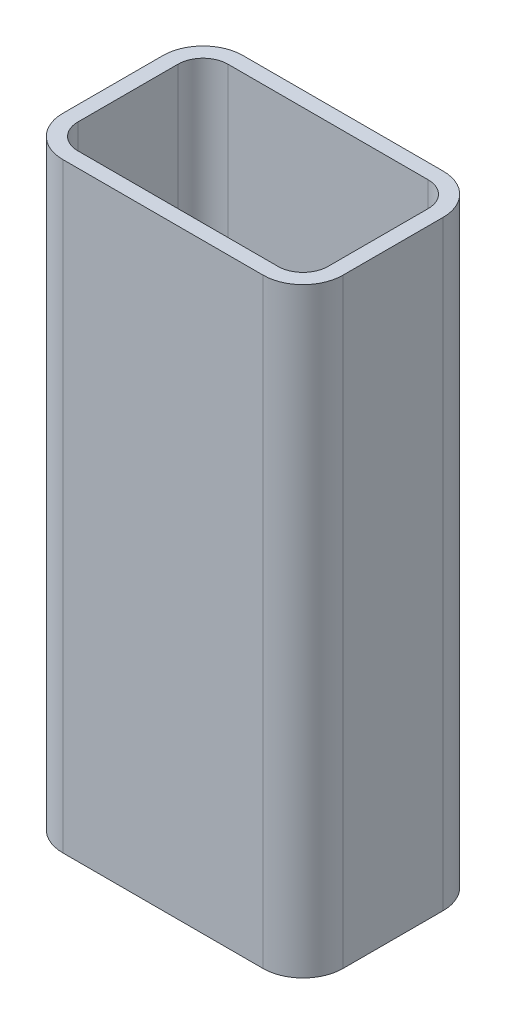
ISO-10303-21;
HEADER;
FILE_DESCRIPTION(('STEP AP214'),'2;1');
FILE_NAME('part.step','',(''),(''),'','','');
FILE_SCHEMA(('AUTOMOTIVE_DESIGN { 1 0 10303 214 1 1 1 1 }'));
ENDSEC;
DATA;
#1=APPLICATION_CONTEXT('core data for automotive mechanical design processes');
#2=APPLICATION_PROTOCOL_DEFINITION('international standard','automotive_design',2000,#1);
#3=PRODUCT_CONTEXT('',#1,'mechanical');
#4=PRODUCT('Part','Part','',(#3));
#5=PRODUCT_RELATED_PRODUCT_CATEGORY('part','',(#4));
#6=PRODUCT_DEFINITION_FORMATION('','',#4);
#7=PRODUCT_DEFINITION_CONTEXT('part definition',#1,'design');
#8=PRODUCT_DEFINITION('design','',#6,#7);
#9=PRODUCT_DEFINITION_SHAPE('','',#8);
#10=(LENGTH_UNIT() NAMED_UNIT(*) SI_UNIT(.MILLI.,.METRE.));
#11=(NAMED_UNIT(*) PLANE_ANGLE_UNIT() SI_UNIT($,.RADIAN.));
#12=(NAMED_UNIT(*) SI_UNIT($,.STERADIAN.) SOLID_ANGLE_UNIT());
#13=UNCERTAINTY_MEASURE_WITH_UNIT(LENGTH_MEASURE(1.E-05),#10,'distance_accuracy_value','');
#14=(GEOMETRIC_REPRESENTATION_CONTEXT(3) GLOBAL_UNCERTAINTY_ASSIGNED_CONTEXT((#13)) GLOBAL_UNIT_ASSIGNED_CONTEXT((#10,
#11,#12)) REPRESENTATION_CONTEXT('',''));
#15=CARTESIAN_POINT('',(0.,0.,0.));
#16=DIRECTION('',(0.,0.,1.));
#17=DIRECTION('',(1.,0.,0.));
#18=AXIS2_PLACEMENT_3D('',#15,#16,#17);
#19=CARTESIAN_POINT('',(-20.,60.,-9.99999999999999));
#20=DIRECTION('',(0.,-1.,0.));
#21=DIRECTION('',(0.,0.,-1.));
#22=AXIS2_PLACEMENT_3D('',#19,#20,#21);
#23=PLANE('',#22);
#24=CARTESIAN_POINT('',(-20.,60.,-9.99999999999999));
#25=DIRECTION('',(0.,-1.,0.));
#26=DIRECTION('',(-1.,0.,0.));
#27=AXIS2_PLACEMENT_3D('',#24,#25,#26);
#28=CIRCLE('',#27,8.);
#29=CARTESIAN_POINT('',(-20.,60.,-18.));
#30=VERTEX_POINT('',#29);
#31=CARTESIAN_POINT('',(-28.,60.,-9.99999999999999));
#32=VERTEX_POINT('',#31);
#33=EDGE_CURVE('E291',#30,#32,#28,.F.);
#34=ORIENTED_EDGE('',*,*,#33,.T.);
#35=DIRECTION('',(0.,0.,1.));
#36=VECTOR('',#35,1.);
#37=CARTESIAN_POINT('',(-28.,60.,-9.99999999999999));
#38=LINE('',#37,#36);
#39=CARTESIAN_POINT('',(-28.,60.,10.));
#40=VERTEX_POINT('',#39);
#41=EDGE_CURVE('E295',#32,#40,#38,.T.);
#42=ORIENTED_EDGE('',*,*,#41,.T.);
#43=CARTESIAN_POINT('',(-20.,60.,10.));
#44=DIRECTION('',(0.,-1.,0.));
#45=DIRECTION('',(-1.,0.,0.));
#46=AXIS2_PLACEMENT_3D('',#43,#44,#45);
#47=CIRCLE('',#46,8.);
#48=CARTESIAN_POINT('',(-20.,60.,18.));
#49=VERTEX_POINT('',#48);
#50=EDGE_CURVE('E299',#40,#49,#47,.F.);
#51=ORIENTED_EDGE('',*,*,#50,.T.);
#52=DIRECTION('',(1.,0.,0.));
#53=VECTOR('',#52,1.);
#54=CARTESIAN_POINT('',(-20.,60.,18.));
#55=LINE('',#54,#53);
#56=CARTESIAN_POINT('',(20.,60.,18.));
#57=VERTEX_POINT('',#56);
#58=EDGE_CURVE('E302',#49,#57,#55,.T.);
#59=ORIENTED_EDGE('',*,*,#58,.T.);
#60=CARTESIAN_POINT('',(20.,60.,10.));
#61=DIRECTION('',(0.,-1.,0.));
#62=DIRECTION('',(-1.,0.,0.));
#63=AXIS2_PLACEMENT_3D('',#60,#61,#62);
#64=CIRCLE('',#63,8.);
#65=CARTESIAN_POINT('',(28.,60.,10.));
#66=VERTEX_POINT('',#65);
#67=EDGE_CURVE('E305',#57,#66,#64,.F.);
#68=ORIENTED_EDGE('',*,*,#67,.T.);
#69=DIRECTION('',(0.,0.,-1.));
#70=VECTOR('',#69,1.);
#71=CARTESIAN_POINT('',(28.,60.,-9.99999999999999));
#72=LINE('',#71,#70);
#73=CARTESIAN_POINT('',(28.,60.,-9.99999999999999));
#74=VERTEX_POINT('',#73);
#75=EDGE_CURVE('E308',#66,#74,#72,.T.);
#76=ORIENTED_EDGE('',*,*,#75,.T.);
#77=CARTESIAN_POINT('',(20.,60.,-9.99999999999999));
#78=DIRECTION('',(0.,-1.,0.));
#79=DIRECTION('',(-1.,0.,0.));
#80=AXIS2_PLACEMENT_3D('',#77,#78,#79);
#81=CIRCLE('',#80,8.);
#82=CARTESIAN_POINT('',(20.,60.,-18.));
#83=VERTEX_POINT('',#82);
#84=EDGE_CURVE('E311',#74,#83,#81,.F.);
#85=ORIENTED_EDGE('',*,*,#84,.T.);
#86=DIRECTION('',(-1.,0.,0.));
#87=VECTOR('',#86,1.);
#88=CARTESIAN_POINT('',(-20.,60.,-18.));
#89=LINE('',#88,#87);
#90=EDGE_CURVE('E314',#83,#30,#89,.T.);
#91=ORIENTED_EDGE('',*,*,#90,.T.);
#92=EDGE_LOOP('',(#34,#42,#51,#59,#68,#76,#85,#91));
#93=FACE_BOUND('',#92,.T.);
#94=CARTESIAN_POINT('',(-20.,60.,-9.99999999999999));
#95=DIRECTION('',(0.,1.,0.));
#96=DIRECTION('',(0.,0.,-1.));
#97=AXIS2_PLACEMENT_3D('',#94,#95,#96);
#98=CIRCLE('',#97,5.);
#99=CARTESIAN_POINT('',(-20.,60.,-15.));
#100=VERTEX_POINT('',#99);
#101=CARTESIAN_POINT('',(-25.,60.,-9.99999999999999));
#102=VERTEX_POINT('',#101);
#103=EDGE_CURVE('E202',#100,#102,#98,.T.);
#104=ORIENTED_EDGE('',*,*,#103,.F.);
#105=DIRECTION('',(-1.,0.,0.));
#106=VECTOR('',#105,1.);
#107=CARTESIAN_POINT('',(-20.,60.,-15.));
#108=LINE('',#107,#106);
#109=CARTESIAN_POINT('',(20.,60.,-15.));
#110=VERTEX_POINT('',#109);
#111=EDGE_CURVE('E243',#110,#100,#108,.T.);
#112=ORIENTED_EDGE('',*,*,#111,.F.);
#113=CARTESIAN_POINT('',(20.,60.,-9.99999999999999));
#114=DIRECTION('',(0.,1.,0.));
#115=DIRECTION('',(0.,0.,-1.));
#116=AXIS2_PLACEMENT_3D('',#113,#114,#115);
#117=CIRCLE('',#116,5.);
#118=CARTESIAN_POINT('',(25.,60.,-9.99999999999999));
#119=VERTEX_POINT('',#118);
#120=EDGE_CURVE('E240',#119,#110,#117,.T.);
#121=ORIENTED_EDGE('',*,*,#120,.F.);
#122=DIRECTION('',(0.,0.,-1.));
#123=VECTOR('',#122,1.);
#124=CARTESIAN_POINT('',(25.,60.,10.));
#125=LINE('',#124,#123);
#126=CARTESIAN_POINT('',(25.,60.,10.));
#127=VERTEX_POINT('',#126);
#128=EDGE_CURVE('E237',#127,#119,#125,.T.);
#129=ORIENTED_EDGE('',*,*,#128,.F.);
#130=CARTESIAN_POINT('',(20.,60.,10.));
#131=DIRECTION('',(0.,1.,0.));
#132=DIRECTION('',(0.,0.,1.));
#133=AXIS2_PLACEMENT_3D('',#130,#131,#132);
#134=CIRCLE('',#133,5.);
#135=CARTESIAN_POINT('',(20.,60.,15.));
#136=VERTEX_POINT('',#135);
#137=EDGE_CURVE('E234',#136,#127,#134,.T.);
#138=ORIENTED_EDGE('',*,*,#137,.F.);
#139=DIRECTION('',(1.,0.,0.));
#140=VECTOR('',#139,1.);
#141=CARTESIAN_POINT('',(-20.,60.,15.));
#142=LINE('',#141,#140);
#143=CARTESIAN_POINT('',(-20.,60.,15.));
#144=VERTEX_POINT('',#143);
#145=EDGE_CURVE('E229',#144,#136,#142,.T.);
#146=ORIENTED_EDGE('',*,*,#145,.F.);
#147=CARTESIAN_POINT('',(-20.,60.,10.));
#148=DIRECTION('',(0.,1.,0.));
#149=DIRECTION('',(0.,0.,-1.));
#150=AXIS2_PLACEMENT_3D('',#147,#148,#149);
#151=CIRCLE('',#150,5.);
#152=CARTESIAN_POINT('',(-25.,60.,10.));
#153=VERTEX_POINT('',#152);
#154=EDGE_CURVE('E225',#153,#144,#151,.T.);
#155=ORIENTED_EDGE('',*,*,#154,.F.);
#156=DIRECTION('',(0.,0.,1.));
#157=VECTOR('',#156,1.);
#158=CARTESIAN_POINT('',(-25.,60.,10.));
#159=LINE('',#158,#157);
#160=EDGE_CURVE('E211',#102,#153,#159,.T.);
#161=ORIENTED_EDGE('',*,*,#160,.F.);
#162=EDGE_LOOP('',(#104,#112,#121,#129,#138,#146,#155,#161));
#163=FACE_BOUND('',#162,.T.);
#164=ADVANCED_FACE('F88',(#93,#163),#23,.F.);
#165=CARTESIAN_POINT('',(-20.,-60.,-9.99999999999999));
#166=DIRECTION('',(0.,-1.,0.));
#167=DIRECTION('',(0.,0.,-1.));
#168=AXIS2_PLACEMENT_3D('',#165,#166,#167);
#169=PLANE('',#168);
#170=CARTESIAN_POINT('',(-20.,-60.,-9.99999999999999));
#171=DIRECTION('',(0.,-1.,0.));
#172=DIRECTION('',(-1.,0.,0.));
#173=AXIS2_PLACEMENT_3D('',#170,#171,#172);
#174=CIRCLE('',#173,8.);
#175=CARTESIAN_POINT('',(-20.,-60.,-18.));
#176=VERTEX_POINT('',#175);
#177=CARTESIAN_POINT('',(-28.,-60.,-9.99999999999999));
#178=VERTEX_POINT('',#177);
#179=EDGE_CURVE('E220',#176,#178,#174,.F.);
#180=ORIENTED_EDGE('',*,*,#179,.F.);
#181=DIRECTION('',(-1.,0.,0.));
#182=VECTOR('',#181,1.);
#183=CARTESIAN_POINT('',(-20.,-60.,-18.));
#184=LINE('',#183,#182);
#185=CARTESIAN_POINT('',(20.,-60.,-18.));
#186=VERTEX_POINT('',#185);
#187=EDGE_CURVE('E296',#186,#176,#184,.T.);
#188=ORIENTED_EDGE('',*,*,#187,.F.);
#189=CARTESIAN_POINT('',(20.,-60.,-9.99999999999999));
#190=DIRECTION('',(0.,-1.,0.));
#191=DIRECTION('',(-1.,0.,0.));
#192=AXIS2_PLACEMENT_3D('',#189,#190,#191);
#193=CIRCLE('',#192,8.);
#194=CARTESIAN_POINT('',(28.,-60.,-9.99999999999999));
#195=VERTEX_POINT('',#194);
#196=EDGE_CURVE('E336',#195,#186,#193,.F.);
#197=ORIENTED_EDGE('',*,*,#196,.F.);
#198=DIRECTION('',(0.,0.,-1.));
#199=VECTOR('',#198,1.);
#200=CARTESIAN_POINT('',(28.,-60.,-9.99999999999999));
#201=LINE('',#200,#199);
#202=CARTESIAN_POINT('',(28.,-60.,10.));
#203=VERTEX_POINT('',#202);
#204=EDGE_CURVE('E333',#203,#195,#201,.T.);
#205=ORIENTED_EDGE('',*,*,#204,.F.);
#206=CARTESIAN_POINT('',(20.,-60.,10.));
#207=DIRECTION('',(0.,-1.,0.));
#208=DIRECTION('',(-1.,0.,0.));
#209=AXIS2_PLACEMENT_3D('',#206,#207,#208);
#210=CIRCLE('',#209,8.);
#211=CARTESIAN_POINT('',(20.,-60.,18.));
#212=VERTEX_POINT('',#211);
#213=EDGE_CURVE('E330',#212,#203,#210,.F.);
#214=ORIENTED_EDGE('',*,*,#213,.F.);
#215=DIRECTION('',(1.,0.,0.));
#216=VECTOR('',#215,1.);
#217=CARTESIAN_POINT('',(-20.,-60.,18.));
#218=LINE('',#217,#216);
#219=CARTESIAN_POINT('',(-20.,-60.,18.));
#220=VERTEX_POINT('',#219);
#221=EDGE_CURVE('E327',#220,#212,#218,.T.);
#222=ORIENTED_EDGE('',*,*,#221,.F.);
#223=CARTESIAN_POINT('',(-20.,-60.,10.));
#224=DIRECTION('',(0.,-1.,0.));
#225=DIRECTION('',(-1.,0.,0.));
#226=AXIS2_PLACEMENT_3D('',#223,#224,#225);
#227=CIRCLE('',#226,8.);
#228=CARTESIAN_POINT('',(-28.,-60.,10.));
#229=VERTEX_POINT('',#228);
#230=EDGE_CURVE('E324',#229,#220,#227,.F.);
#231=ORIENTED_EDGE('',*,*,#230,.F.);
#232=DIRECTION('',(0.,0.,1.));
#233=VECTOR('',#232,1.);
#234=CARTESIAN_POINT('',(-28.,-60.,-9.99999999999999));
#235=LINE('',#234,#233);
#236=EDGE_CURVE('E321',#178,#229,#235,.T.);
#237=ORIENTED_EDGE('',*,*,#236,.F.);
#238=EDGE_LOOP('',(#180,#188,#197,#205,#214,#222,#231,#237));
#239=FACE_BOUND('',#238,.T.);
#240=DIRECTION('',(-1.,0.,0.));
#241=VECTOR('',#240,1.);
#242=CARTESIAN_POINT('',(-20.,-60.,-15.));
#243=LINE('',#242,#241);
#244=CARTESIAN_POINT('',(20.,-60.,-15.));
#245=VERTEX_POINT('',#244);
#246=CARTESIAN_POINT('',(-20.,-60.,-15.));
#247=VERTEX_POINT('',#246);
#248=EDGE_CURVE('E212',#245,#247,#243,.T.);
#249=ORIENTED_EDGE('',*,*,#248,.T.);
#250=CARTESIAN_POINT('',(-20.,-60.,-9.99999999999999));
#251=DIRECTION('',(0.,1.,0.));
#252=DIRECTION('',(0.,0.,-1.));
#253=AXIS2_PLACEMENT_3D('',#250,#251,#252);
#254=CIRCLE('',#253,5.);
#255=CARTESIAN_POINT('',(-25.,-60.,-9.99999999999999));
#256=VERTEX_POINT('',#255);
#257=EDGE_CURVE('E112',#247,#256,#254,.T.);
#258=ORIENTED_EDGE('',*,*,#257,.T.);
#259=DIRECTION('',(0.,0.,1.));
#260=VECTOR('',#259,1.);
#261=CARTESIAN_POINT('',(-25.,-60.,10.));
#262=LINE('',#261,#260);
#263=CARTESIAN_POINT('',(-25.,-60.,10.));
#264=VERTEX_POINT('',#263);
#265=EDGE_CURVE('E218',#256,#264,#262,.T.);
#266=ORIENTED_EDGE('',*,*,#265,.T.);
#267=CARTESIAN_POINT('',(-20.,-60.,10.));
#268=DIRECTION('',(0.,1.,0.));
#269=DIRECTION('',(0.,0.,-1.));
#270=AXIS2_PLACEMENT_3D('',#267,#268,#269);
#271=CIRCLE('',#270,5.);
#272=CARTESIAN_POINT('',(-20.,-60.,15.));
#273=VERTEX_POINT('',#272);
#274=EDGE_CURVE('E250',#264,#273,#271,.T.);
#275=ORIENTED_EDGE('',*,*,#274,.T.);
#276=DIRECTION('',(1.,0.,0.));
#277=VECTOR('',#276,1.);
#278=CARTESIAN_POINT('',(-20.,-60.,15.));
#279=LINE('',#278,#277);
#280=CARTESIAN_POINT('',(20.,-60.,15.));
#281=VERTEX_POINT('',#280);
#282=EDGE_CURVE('E254',#273,#281,#279,.T.);
#283=ORIENTED_EDGE('',*,*,#282,.T.);
#284=CARTESIAN_POINT('',(20.,-60.,10.));
#285=DIRECTION('',(0.,1.,0.));
#286=DIRECTION('',(0.,0.,1.));
#287=AXIS2_PLACEMENT_3D('',#284,#285,#286);
#288=CIRCLE('',#287,5.);
#289=CARTESIAN_POINT('',(25.,-60.,10.));
#290=VERTEX_POINT('',#289);
#291=EDGE_CURVE('E258',#281,#290,#288,.T.);
#292=ORIENTED_EDGE('',*,*,#291,.T.);
#293=DIRECTION('',(0.,0.,-1.));
#294=VECTOR('',#293,1.);
#295=CARTESIAN_POINT('',(25.,-60.,10.));
#296=LINE('',#295,#294);
#297=CARTESIAN_POINT('',(25.,-60.,-9.99999999999999));
#298=VERTEX_POINT('',#297);
#299=EDGE_CURVE('E262',#290,#298,#296,.T.);
#300=ORIENTED_EDGE('',*,*,#299,.T.);
#301=CARTESIAN_POINT('',(20.,-60.,-9.99999999999999));
#302=DIRECTION('',(0.,1.,0.));
#303=DIRECTION('',(0.,0.,-1.));
#304=AXIS2_PLACEMENT_3D('',#301,#302,#303);
#305=CIRCLE('',#304,5.);
#306=EDGE_CURVE('E266',#298,#245,#305,.T.);
#307=ORIENTED_EDGE('',*,*,#306,.T.);
#308=EDGE_LOOP('',(#249,#258,#266,#275,#283,#292,#300,#307));
#309=FACE_BOUND('',#308,.T.);
#310=ADVANCED_FACE('F375',(#239,#309),#169,.T.);
#311=CARTESIAN_POINT('',(-20.,60.,-9.99999999999999));
#312=DIRECTION('',(0.,-1.,0.));
#313=DIRECTION('',(0.,0.,-1.));
#314=AXIS2_PLACEMENT_3D('',#311,#312,#313);
#315=CYLINDRICAL_SURFACE('',#314,8.);
#316=ORIENTED_EDGE('',*,*,#179,.T.);
#317=DIRECTION('',(0.,-1.,0.));
#318=VECTOR('',#317,1.);
#319=CARTESIAN_POINT('',(-28.,60.,-9.99999999999999));
#320=LINE('',#319,#318);
#321=EDGE_CURVE('E12',#32,#178,#320,.T.);
#322=ORIENTED_EDGE('',*,*,#321,.F.);
#323=ORIENTED_EDGE('',*,*,#33,.F.);
#324=DIRECTION('',(0.,-1.,0.));
#325=VECTOR('',#324,1.);
#326=CARTESIAN_POINT('',(-20.,60.,-18.));
#327=LINE('',#326,#325);
#328=EDGE_CURVE('E317',#30,#176,#327,.T.);
#329=ORIENTED_EDGE('',*,*,#328,.T.);
#330=EDGE_LOOP('',(#316,#322,#323,#329));
#331=FACE_BOUND('',#330,.T.);
#332=ADVANCED_FACE('F90',(#331),#315,.T.);
#333=CARTESIAN_POINT('',(-28.,60.,-9.99999999999999));
#334=DIRECTION('',(1.,0.,0.));
#335=DIRECTION('',(0.,0.,-1.));
#336=AXIS2_PLACEMENT_3D('',#333,#334,#335);
#337=PLANE('',#336);
#338=ORIENTED_EDGE('',*,*,#236,.T.);
#339=DIRECTION('',(0.,-1.,0.));
#340=VECTOR('',#339,1.);
#341=CARTESIAN_POINT('',(-28.,60.,10.));
#342=LINE('',#341,#340);
#343=EDGE_CURVE('E97',#40,#229,#342,.T.);
#344=ORIENTED_EDGE('',*,*,#343,.F.);
#345=ORIENTED_EDGE('',*,*,#41,.F.);
#346=ORIENTED_EDGE('',*,*,#321,.T.);
#347=EDGE_LOOP('',(#338,#344,#345,#346));
#348=FACE_BOUND('',#347,.T.);
#349=ADVANCED_FACE('F392',(#348),#337,.F.);
#350=CARTESIAN_POINT('',(-20.,60.,10.));
#351=DIRECTION('',(0.,-1.,0.));
#352=DIRECTION('',(0.,0.,-1.));
#353=AXIS2_PLACEMENT_3D('',#350,#351,#352);
#354=CYLINDRICAL_SURFACE('',#353,8.);
#355=ORIENTED_EDGE('',*,*,#230,.T.);
#356=DIRECTION('',(0.,-1.,0.));
#357=VECTOR('',#356,1.);
#358=CARTESIAN_POINT('',(-20.,60.,18.));
#359=LINE('',#358,#357);
#360=EDGE_CURVE('E360',#49,#220,#359,.T.);
#361=ORIENTED_EDGE('',*,*,#360,.F.);
#362=ORIENTED_EDGE('',*,*,#50,.F.);
#363=ORIENTED_EDGE('',*,*,#343,.T.);
#364=EDGE_LOOP('',(#355,#361,#362,#363));
#365=FACE_BOUND('',#364,.T.);
#366=ADVANCED_FACE('F369',(#365),#354,.T.);
#367=CARTESIAN_POINT('',(-20.,60.,18.));
#368=DIRECTION('',(0.,0.,-1.));
#369=DIRECTION('',(-1.,0.,0.));
#370=AXIS2_PLACEMENT_3D('',#367,#368,#369);
#371=PLANE('',#370);
#372=ORIENTED_EDGE('',*,*,#221,.T.);
#373=DIRECTION('',(0.,-1.,0.));
#374=VECTOR('',#373,1.);
#375=CARTESIAN_POINT('',(20.,60.,18.));
#376=LINE('',#375,#374);
#377=EDGE_CURVE('E356',#57,#212,#376,.T.);
#378=ORIENTED_EDGE('',*,*,#377,.F.);
#379=ORIENTED_EDGE('',*,*,#58,.F.);
#380=ORIENTED_EDGE('',*,*,#360,.T.);
#381=EDGE_LOOP('',(#372,#378,#379,#380));
#382=FACE_BOUND('',#381,.T.);
#383=ADVANCED_FACE('F381',(#382),#371,.F.);
#384=CARTESIAN_POINT('',(20.,60.,10.));
#385=DIRECTION('',(0.,-1.,0.));
#386=DIRECTION('',(0.,0.,-1.));
#387=AXIS2_PLACEMENT_3D('',#384,#385,#386);
#388=CYLINDRICAL_SURFACE('',#387,8.);
#389=ORIENTED_EDGE('',*,*,#213,.T.);
#390=DIRECTION('',(0.,-1.,0.));
#391=VECTOR('',#390,1.);
#392=CARTESIAN_POINT('',(28.,60.,10.));
#393=LINE('',#392,#391);
#394=EDGE_CURVE('E352',#66,#203,#393,.T.);
#395=ORIENTED_EDGE('',*,*,#394,.F.);
#396=ORIENTED_EDGE('',*,*,#67,.F.);
#397=ORIENTED_EDGE('',*,*,#377,.T.);
#398=EDGE_LOOP('',(#389,#395,#396,#397));
#399=FACE_BOUND('',#398,.T.);
#400=ADVANCED_FACE('F385',(#399),#388,.T.);
#401=CARTESIAN_POINT('',(28.,60.,-9.99999999999999));
#402=DIRECTION('',(-1.,0.,0.));
#403=DIRECTION('',(0.,0.,1.));
#404=AXIS2_PLACEMENT_3D('',#401,#402,#403);
#405=PLANE('',#404);
#406=ORIENTED_EDGE('',*,*,#204,.T.);
#407=DIRECTION('',(0.,-1.,0.));
#408=VECTOR('',#407,1.);
#409=CARTESIAN_POINT('',(28.,60.,-9.99999999999999));
#410=LINE('',#409,#408);
#411=EDGE_CURVE('E348',#74,#195,#410,.T.);
#412=ORIENTED_EDGE('',*,*,#411,.F.);
#413=ORIENTED_EDGE('',*,*,#75,.F.);
#414=ORIENTED_EDGE('',*,*,#394,.T.);
#415=EDGE_LOOP('',(#406,#412,#413,#414));
#416=FACE_BOUND('',#415,.T.);
#417=ADVANCED_FACE('F405',(#416),#405,.F.);
#418=CARTESIAN_POINT('',(20.,60.,-9.99999999999999));
#419=DIRECTION('',(0.,-1.,0.));
#420=DIRECTION('',(0.,0.,-1.));
#421=AXIS2_PLACEMENT_3D('',#418,#419,#420);
#422=CYLINDRICAL_SURFACE('',#421,8.);
#423=ORIENTED_EDGE('',*,*,#196,.T.);
#424=DIRECTION('',(0.,-1.,0.));
#425=VECTOR('',#424,1.);
#426=CARTESIAN_POINT('',(20.,60.,-18.));
#427=LINE('',#426,#425);
#428=EDGE_CURVE('E344',#83,#186,#427,.T.);
#429=ORIENTED_EDGE('',*,*,#428,.F.);
#430=ORIENTED_EDGE('',*,*,#84,.F.);
#431=ORIENTED_EDGE('',*,*,#411,.T.);
#432=EDGE_LOOP('',(#423,#429,#430,#431));
#433=FACE_BOUND('',#432,.T.);
#434=ADVANCED_FACE('F403',(#433),#422,.T.);
#435=CARTESIAN_POINT('',(-20.,60.,-18.));
#436=DIRECTION('',(0.,0.,1.));
#437=DIRECTION('',(1.,0.,0.));
#438=AXIS2_PLACEMENT_3D('',#435,#436,#437);
#439=PLANE('',#438);
#440=ORIENTED_EDGE('',*,*,#187,.T.);
#441=ORIENTED_EDGE('',*,*,#328,.F.);
#442=ORIENTED_EDGE('',*,*,#90,.F.);
#443=ORIENTED_EDGE('',*,*,#428,.T.);
#444=EDGE_LOOP('',(#440,#441,#442,#443));
#445=FACE_BOUND('',#444,.T.);
#446=ADVANCED_FACE('F398',(#445),#439,.F.);
#447=CARTESIAN_POINT('',(-20.,60.,-9.99999999999999));
#448=DIRECTION('',(0.,-1.,0.));
#449=DIRECTION('',(0.,0.,-1.));
#450=AXIS2_PLACEMENT_3D('',#447,#448,#449);
#451=CYLINDRICAL_SURFACE('',#450,5.);
#452=ORIENTED_EDGE('',*,*,#257,.F.);
#453=DIRECTION('',(0.,-1.,0.));
#454=VECTOR('',#453,1.);
#455=CARTESIAN_POINT('',(-20.,60.,-15.));
#456=LINE('',#455,#454);
#457=EDGE_CURVE('E206',#100,#247,#456,.T.);
#458=ORIENTED_EDGE('',*,*,#457,.F.);
#459=ORIENTED_EDGE('',*,*,#103,.T.);
#460=DIRECTION('',(0.,-1.,0.));
#461=VECTOR('',#460,1.);
#462=CARTESIAN_POINT('',(-25.,60.,-9.99999999999999));
#463=LINE('',#462,#461);
#464=EDGE_CURVE('E205',#102,#256,#463,.T.);
#465=ORIENTED_EDGE('',*,*,#464,.T.);
#466=EDGE_LOOP('',(#452,#458,#459,#465));
#467=FACE_BOUND('',#466,.T.);
#468=ADVANCED_FACE('F204',(#467),#451,.F.);
#469=CARTESIAN_POINT('',(-25.,60.,10.));
#470=DIRECTION('',(1.,0.,0.));
#471=DIRECTION('',(0.,0.,-1.));
#472=AXIS2_PLACEMENT_3D('',#469,#470,#471);
#473=PLANE('',#472);
#474=ORIENTED_EDGE('',*,*,#265,.F.);
#475=ORIENTED_EDGE('',*,*,#464,.F.);
#476=ORIENTED_EDGE('',*,*,#160,.T.);
#477=DIRECTION('',(0.,-1.,0.));
#478=VECTOR('',#477,1.);
#479=CARTESIAN_POINT('',(-25.,60.,10.));
#480=LINE('',#479,#478);
#481=EDGE_CURVE('E221',#153,#264,#480,.T.);
#482=ORIENTED_EDGE('',*,*,#481,.T.);
#483=EDGE_LOOP('',(#474,#475,#476,#482));
#484=FACE_BOUND('',#483,.T.);
#485=ADVANCED_FACE('F215',(#484),#473,.T.);
#486=CARTESIAN_POINT('',(-20.,60.,10.));
#487=DIRECTION('',(0.,-1.,0.));
#488=DIRECTION('',(0.,0.,-1.));
#489=AXIS2_PLACEMENT_3D('',#486,#487,#488);
#490=CYLINDRICAL_SURFACE('',#489,5.);
#491=ORIENTED_EDGE('',*,*,#274,.F.);
#492=ORIENTED_EDGE('',*,*,#481,.F.);
#493=ORIENTED_EDGE('',*,*,#154,.T.);
#494=DIRECTION('',(0.,-1.,0.));
#495=VECTOR('',#494,1.);
#496=CARTESIAN_POINT('',(-20.,60.,15.));
#497=LINE('',#496,#495);
#498=EDGE_CURVE('E286',#144,#273,#497,.T.);
#499=ORIENTED_EDGE('',*,*,#498,.T.);
#500=EDGE_LOOP('',(#491,#492,#493,#499));
#501=FACE_BOUND('',#500,.T.);
#502=ADVANCED_FACE('F430',(#501),#490,.F.);
#503=CARTESIAN_POINT('',(-20.,60.,15.));
#504=DIRECTION('',(0.,0.,-1.));
#505=DIRECTION('',(-1.,0.,0.));
#506=AXIS2_PLACEMENT_3D('',#503,#504,#505);
#507=PLANE('',#506);
#508=ORIENTED_EDGE('',*,*,#282,.F.);
#509=ORIENTED_EDGE('',*,*,#498,.F.);
#510=ORIENTED_EDGE('',*,*,#145,.T.);
#511=DIRECTION('',(0.,-1.,0.));
#512=VECTOR('',#511,1.);
#513=CARTESIAN_POINT('',(20.,60.,15.));
#514=LINE('',#513,#512);
#515=EDGE_CURVE('E283',#136,#281,#514,.T.);
#516=ORIENTED_EDGE('',*,*,#515,.T.);
#517=EDGE_LOOP('',(#508,#509,#510,#516));
#518=FACE_BOUND('',#517,.T.);
#519=ADVANCED_FACE('F434',(#518),#507,.T.);
#520=CARTESIAN_POINT('',(20.,60.,10.));
#521=DIRECTION('',(0.,-1.,0.));
#522=DIRECTION('',(0.,0.,-1.));
#523=AXIS2_PLACEMENT_3D('',#520,#521,#522);
#524=CYLINDRICAL_SURFACE('',#523,5.);
#525=ORIENTED_EDGE('',*,*,#291,.F.);
#526=ORIENTED_EDGE('',*,*,#515,.F.);
#527=ORIENTED_EDGE('',*,*,#137,.T.);
#528=DIRECTION('',(0.,-1.,0.));
#529=VECTOR('',#528,1.);
#530=CARTESIAN_POINT('',(25.,60.,10.));
#531=LINE('',#530,#529);
#532=EDGE_CURVE('E280',#127,#290,#531,.T.);
#533=ORIENTED_EDGE('',*,*,#532,.T.);
#534=EDGE_LOOP('',(#525,#526,#527,#533));
#535=FACE_BOUND('',#534,.T.);
#536=ADVANCED_FACE('F440',(#535),#524,.F.);
#537=CARTESIAN_POINT('',(25.,60.,10.));
#538=DIRECTION('',(-1.,0.,0.));
#539=DIRECTION('',(0.,0.,1.));
#540=AXIS2_PLACEMENT_3D('',#537,#538,#539);
#541=PLANE('',#540);
#542=ORIENTED_EDGE('',*,*,#299,.F.);
#543=ORIENTED_EDGE('',*,*,#532,.F.);
#544=ORIENTED_EDGE('',*,*,#128,.T.);
#545=DIRECTION('',(0.,-1.,0.));
#546=VECTOR('',#545,1.);
#547=CARTESIAN_POINT('',(25.,60.,-9.99999999999999));
#548=LINE('',#547,#546);
#549=EDGE_CURVE('E277',#119,#298,#548,.T.);
#550=ORIENTED_EDGE('',*,*,#549,.T.);
#551=EDGE_LOOP('',(#542,#543,#544,#550));
#552=FACE_BOUND('',#551,.T.);
#553=ADVANCED_FACE('F444',(#552),#541,.T.);
#554=CARTESIAN_POINT('',(20.,60.,-9.99999999999999));
#555=DIRECTION('',(0.,-1.,0.));
#556=DIRECTION('',(0.,0.,-1.));
#557=AXIS2_PLACEMENT_3D('',#554,#555,#556);
#558=CYLINDRICAL_SURFACE('',#557,5.);
#559=ORIENTED_EDGE('',*,*,#306,.F.);
#560=ORIENTED_EDGE('',*,*,#549,.F.);
#561=ORIENTED_EDGE('',*,*,#120,.T.);
#562=DIRECTION('',(0.,-1.,0.));
#563=VECTOR('',#562,1.);
#564=CARTESIAN_POINT('',(20.,60.,-15.));
#565=LINE('',#564,#563);
#566=EDGE_CURVE('E104',#110,#245,#565,.T.);
#567=ORIENTED_EDGE('',*,*,#566,.T.);
#568=EDGE_LOOP('',(#559,#560,#561,#567));
#569=FACE_BOUND('',#568,.T.);
#570=ADVANCED_FACE('F448',(#569),#558,.F.);
#571=CARTESIAN_POINT('',(-20.,60.,-15.));
#572=DIRECTION('',(0.,0.,1.));
#573=DIRECTION('',(1.,0.,0.));
#574=AXIS2_PLACEMENT_3D('',#571,#572,#573);
#575=PLANE('',#574);
#576=ORIENTED_EDGE('',*,*,#248,.F.);
#577=ORIENTED_EDGE('',*,*,#566,.F.);
#578=ORIENTED_EDGE('',*,*,#111,.T.);
#579=ORIENTED_EDGE('',*,*,#457,.T.);
#580=EDGE_LOOP('',(#576,#577,#578,#579));
#581=FACE_BOUND('',#580,.T.);
#582=ADVANCED_FACE('F452',(#581),#575,.T.);
#583=CLOSED_SHELL('',(#164,#310,#332,#349,#366,#383,#400,#417,#434,#446,#468,#485,#502,#519,
#536,#553,#570,#582));
#584=MANIFOLD_SOLID_BREP('B2',#583);
#585=ADVANCED_BREP_SHAPE_REPRESENTATION('',(#18,#584),#14);
#586=SHAPE_DEFINITION_REPRESENTATION(#9,#585);
ENDSEC;
END-ISO-10303-21;
